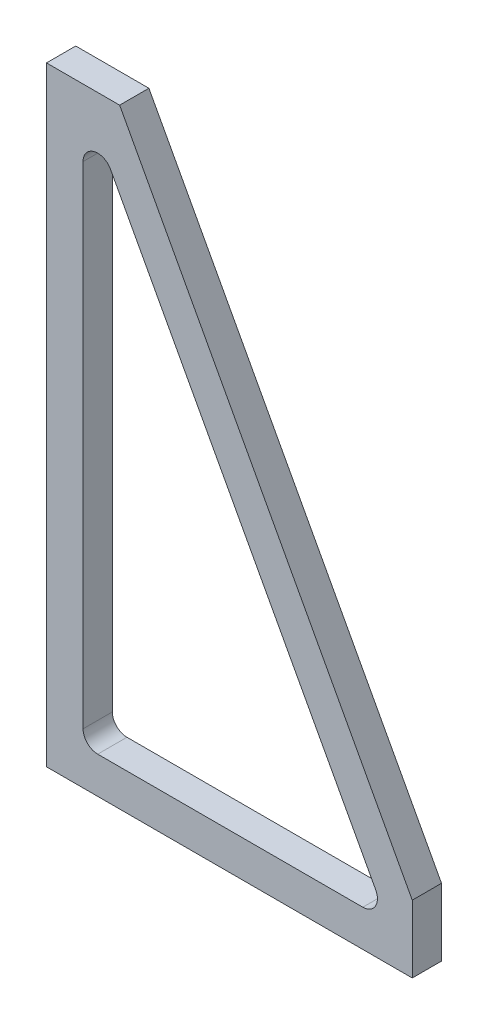
ISO-10303-21;
HEADER;
FILE_DESCRIPTION(('STEP AP214'),'2;1');
FILE_NAME('part.step','',(''),(''),'','','');
FILE_SCHEMA(('AUTOMOTIVE_DESIGN { 1 0 10303 214 1 1 1 1 }'));
ENDSEC;
DATA;
#1=APPLICATION_CONTEXT('core data for automotive mechanical design processes');
#2=APPLICATION_PROTOCOL_DEFINITION('international standard','automotive_design',2000,#1);
#3=PRODUCT_CONTEXT('',#1,'mechanical');
#4=PRODUCT('Part','Part','',(#3));
#5=PRODUCT_RELATED_PRODUCT_CATEGORY('part','',(#4));
#6=PRODUCT_DEFINITION_FORMATION('','',#4);
#7=PRODUCT_DEFINITION_CONTEXT('part definition',#1,'design');
#8=PRODUCT_DEFINITION('design','',#6,#7);
#9=PRODUCT_DEFINITION_SHAPE('','',#8);
#10=(LENGTH_UNIT() NAMED_UNIT(*) SI_UNIT(.MILLI.,.METRE.));
#11=(NAMED_UNIT(*) PLANE_ANGLE_UNIT() SI_UNIT($,.RADIAN.));
#12=(NAMED_UNIT(*) SI_UNIT($,.STERADIAN.) SOLID_ANGLE_UNIT());
#13=UNCERTAINTY_MEASURE_WITH_UNIT(LENGTH_MEASURE(1.E-05),#10,'distance_accuracy_value','');
#14=(GEOMETRIC_REPRESENTATION_CONTEXT(3) GLOBAL_UNCERTAINTY_ASSIGNED_CONTEXT((#13)) GLOBAL_UNIT_ASSIGNED_CONTEXT((#10,
#11,#12)) REPRESENTATION_CONTEXT('',''));
#15=CARTESIAN_POINT('',(0.,0.,0.));
#16=DIRECTION('',(0.,0.,1.));
#17=DIRECTION('',(1.,0.,0.));
#18=AXIS2_PLACEMENT_3D('',#15,#16,#17);
#19=CARTESIAN_POINT('',(0.,0.,12.));
#20=DIRECTION('',(0.,0.,1.));
#21=DIRECTION('',(1.,0.,0.));
#22=AXIS2_PLACEMENT_3D('',#19,#20,#21);
#23=PLANE('',#22);
#24=DIRECTION('',(1.,0.,0.));
#25=VECTOR('',#24,1.);
#26=CARTESIAN_POINT('',(0.,0.,12.));
#27=LINE('',#26,#25);
#28=CARTESIAN_POINT('',(0.,0.,12.));
#29=VERTEX_POINT('',#28);
#30=CARTESIAN_POINT('',(150.,0.,12.));
#31=VERTEX_POINT('',#30);
#32=EDGE_CURVE('E171',#29,#31,#27,.T.);
#33=ORIENTED_EDGE('',*,*,#32,.T.);
#34=DIRECTION('',(0.,1.,0.));
#35=VECTOR('',#34,1.);
#36=CARTESIAN_POINT('',(150.,0.,12.));
#37=LINE('',#36,#35);
#38=CARTESIAN_POINT('',(150.,27.6386984224302,12.));
#39=VERTEX_POINT('',#38);
#40=EDGE_CURVE('E176',#31,#39,#37,.T.);
#41=ORIENTED_EDGE('',*,*,#40,.T.);
#42=DIRECTION('',(-0.474918772063908,0.880029635831265,0.));
#43=VECTOR('',#42,1.);
#44=CARTESIAN_POINT('',(150.,27.6386984224302,12.));
#45=LINE('',#44,#43);
#46=CARTESIAN_POINT('',(30.,250.,12.));
#47=VERTEX_POINT('',#46);
#48=EDGE_CURVE('E177',#39,#47,#45,.T.);
#49=ORIENTED_EDGE('',*,*,#48,.T.);
#50=DIRECTION('',(-1.,0.,0.));
#51=VECTOR('',#50,1.);
#52=CARTESIAN_POINT('',(30.,250.,12.));
#53=LINE('',#52,#51);
#54=CARTESIAN_POINT('',(0.,250.,12.));
#55=VERTEX_POINT('',#54);
#56=EDGE_CURVE('E181',#47,#55,#53,.T.);
#57=ORIENTED_EDGE('',*,*,#56,.T.);
#58=DIRECTION('',(0.,-1.,0.));
#59=VECTOR('',#58,1.);
#60=CARTESIAN_POINT('',(0.,250.,12.));
#61=LINE('',#60,#59);
#62=EDGE_CURVE('E183',#55,#29,#61,.T.);
#63=ORIENTED_EDGE('',*,*,#62,.T.);
#64=EDGE_LOOP('',(#33,#41,#49,#57,#63));
#65=FACE_BOUND('',#64,.T.);
#66=DIRECTION('',(-0.474918772063908,0.880029635831265,0.));
#67=VECTOR('',#66,1.);
#68=CARTESIAN_POINT('',(135.,23.8495126323835,12.));
#69=LINE('',#68,#67);
#70=CARTESIAN_POINT('',(135.,23.8495126323835,12.));
#71=VERTEX_POINT('',#70);
#72=CARTESIAN_POINT('',(26.2801778149876,225.308522368561,12.));
#73=VERTEX_POINT('',#72);
#74=EDGE_CURVE('E127',#71,#73,#69,.T.);
#75=ORIENTED_EDGE('',*,*,#74,.F.);
#76=CARTESIAN_POINT('',(129.719822185012,21.,12.));
#77=DIRECTION('',(0.,0.,1.));
#78=DIRECTION('',(1.,0.,0.));
#79=AXIS2_PLACEMENT_3D('',#76,#77,#78);
#80=CIRCLE('',#79,6.00000000000001);
#81=CARTESIAN_POINT('',(129.719822185013,15.,12.));
#82=VERTEX_POINT('',#81);
#83=EDGE_CURVE('E122',#82,#71,#80,.T.);
#84=ORIENTED_EDGE('',*,*,#83,.F.);
#85=DIRECTION('',(1.,0.,0.));
#86=VECTOR('',#85,1.);
#87=CARTESIAN_POINT('',(21.,15.,12.));
#88=LINE('',#87,#86);
#89=CARTESIAN_POINT('',(21.,15.,12.));
#90=VERTEX_POINT('',#89);
#91=EDGE_CURVE('E152',#90,#82,#88,.T.);
#92=ORIENTED_EDGE('',*,*,#91,.F.);
#93=CARTESIAN_POINT('',(21.,21.,12.));
#94=DIRECTION('',(0.,0.,1.));
#95=DIRECTION('',(-1.,0.,0.));
#96=AXIS2_PLACEMENT_3D('',#93,#94,#95);
#97=CIRCLE('',#96,6.);
#98=CARTESIAN_POINT('',(15.,21.,12.));
#99=VERTEX_POINT('',#98);
#100=EDGE_CURVE('E146',#99,#90,#97,.T.);
#101=ORIENTED_EDGE('',*,*,#100,.F.);
#102=DIRECTION('',(0.,-1.,0.));
#103=VECTOR('',#102,1.);
#104=CARTESIAN_POINT('',(15.,222.459009736178,12.));
#105=LINE('',#104,#103);
#106=CARTESIAN_POINT('',(15.,222.459009736178,12.));
#107=VERTEX_POINT('',#106);
#108=EDGE_CURVE('E144',#107,#99,#105,.T.);
#109=ORIENTED_EDGE('',*,*,#108,.F.);
#110=CARTESIAN_POINT('',(21.,222.459009736178,12.));
#111=DIRECTION('',(0.,0.,1.));
#112=DIRECTION('',(1.,0.,0.));
#113=AXIS2_PLACEMENT_3D('',#110,#111,#112);
#114=CIRCLE('',#113,6.);
#115=EDGE_CURVE('E142',#73,#107,#114,.T.);
#116=ORIENTED_EDGE('',*,*,#115,.F.);
#117=EDGE_LOOP('',(#75,#84,#92,#101,#109,#116));
#118=FACE_BOUND('',#117,.T.);
#119=ADVANCED_FACE('F39',(#65,#118),#23,.T.);
#120=CARTESIAN_POINT('',(0.,0.,0.));
#121=DIRECTION('',(0.,0.,1.));
#122=DIRECTION('',(1.,0.,0.));
#123=AXIS2_PLACEMENT_3D('',#120,#121,#122);
#124=PLANE('',#123);
#125=DIRECTION('',(1.,0.,0.));
#126=VECTOR('',#125,1.);
#127=CARTESIAN_POINT('',(0.,0.,0.));
#128=LINE('',#127,#126);
#129=CARTESIAN_POINT('',(0.,0.,0.));
#130=VERTEX_POINT('',#129);
#131=CARTESIAN_POINT('',(150.,0.,0.));
#132=VERTEX_POINT('',#131);
#133=EDGE_CURVE('E138',#130,#132,#128,.T.);
#134=ORIENTED_EDGE('',*,*,#133,.F.);
#135=DIRECTION('',(0.,-1.,0.));
#136=VECTOR('',#135,1.);
#137=CARTESIAN_POINT('',(0.,250.,0.));
#138=LINE('',#137,#136);
#139=CARTESIAN_POINT('',(0.,250.,0.));
#140=VERTEX_POINT('',#139);
#141=EDGE_CURVE('E180',#140,#130,#138,.T.);
#142=ORIENTED_EDGE('',*,*,#141,.F.);
#143=DIRECTION('',(-1.,0.,0.));
#144=VECTOR('',#143,1.);
#145=CARTESIAN_POINT('',(30.,250.,0.));
#146=LINE('',#145,#144);
#147=CARTESIAN_POINT('',(30.,250.,0.));
#148=VERTEX_POINT('',#147);
#149=EDGE_CURVE('E195',#148,#140,#146,.T.);
#150=ORIENTED_EDGE('',*,*,#149,.F.);
#151=DIRECTION('',(-0.474918772063908,0.880029635831265,0.));
#152=VECTOR('',#151,1.);
#153=CARTESIAN_POINT('',(150.,27.6386984224302,0.));
#154=LINE('',#153,#152);
#155=CARTESIAN_POINT('',(150.,27.6386984224302,0.));
#156=VERTEX_POINT('',#155);
#157=EDGE_CURVE('E189',#156,#148,#154,.T.);
#158=ORIENTED_EDGE('',*,*,#157,.F.);
#159=DIRECTION('',(0.,1.,0.));
#160=VECTOR('',#159,1.);
#161=CARTESIAN_POINT('',(150.,0.,0.));
#162=LINE('',#161,#160);
#163=EDGE_CURVE('E187',#132,#156,#162,.T.);
#164=ORIENTED_EDGE('',*,*,#163,.F.);
#165=EDGE_LOOP('',(#134,#142,#150,#158,#164));
#166=FACE_BOUND('',#165,.T.);
#167=CARTESIAN_POINT('',(129.719822185012,21.,0.));
#168=DIRECTION('',(0.,0.,1.));
#169=DIRECTION('',(1.,0.,0.));
#170=AXIS2_PLACEMENT_3D('',#167,#168,#169);
#171=CIRCLE('',#170,6.00000000000001);
#172=CARTESIAN_POINT('',(129.719822185013,15.,0.));
#173=VERTEX_POINT('',#172);
#174=CARTESIAN_POINT('',(135.,23.8495126323835,0.));
#175=VERTEX_POINT('',#174);
#176=EDGE_CURVE('E65',#173,#175,#171,.T.);
#177=ORIENTED_EDGE('',*,*,#176,.T.);
#178=DIRECTION('',(-0.474918772063908,0.880029635831265,0.));
#179=VECTOR('',#178,1.);
#180=CARTESIAN_POINT('',(135.,23.8495126323835,0.));
#181=LINE('',#180,#179);
#182=CARTESIAN_POINT('',(26.2801778149876,225.308522368561,0.));
#183=VERTEX_POINT('',#182);
#184=EDGE_CURVE('E140',#175,#183,#181,.T.);
#185=ORIENTED_EDGE('',*,*,#184,.T.);
#186=CARTESIAN_POINT('',(21.,222.459009736178,0.));
#187=DIRECTION('',(0.,0.,1.));
#188=DIRECTION('',(1.,0.,0.));
#189=AXIS2_PLACEMENT_3D('',#186,#187,#188);
#190=CIRCLE('',#189,6.);
#191=CARTESIAN_POINT('',(15.,222.459009736178,0.));
#192=VERTEX_POINT('',#191);
#193=EDGE_CURVE('E151',#183,#192,#190,.T.);
#194=ORIENTED_EDGE('',*,*,#193,.T.);
#195=DIRECTION('',(0.,-1.,0.));
#196=VECTOR('',#195,1.);
#197=CARTESIAN_POINT('',(15.,222.459009736178,0.));
#198=LINE('',#197,#196);
#199=CARTESIAN_POINT('',(15.,21.,0.));
#200=VERTEX_POINT('',#199);
#201=EDGE_CURVE('E156',#192,#200,#198,.T.);
#202=ORIENTED_EDGE('',*,*,#201,.T.);
#203=CARTESIAN_POINT('',(21.,21.,0.));
#204=DIRECTION('',(0.,0.,1.));
#205=DIRECTION('',(-1.,0.,0.));
#206=AXIS2_PLACEMENT_3D('',#203,#204,#205);
#207=CIRCLE('',#206,6.);
#208=CARTESIAN_POINT('',(21.,15.,0.));
#209=VERTEX_POINT('',#208);
#210=EDGE_CURVE('E162',#200,#209,#207,.T.);
#211=ORIENTED_EDGE('',*,*,#210,.T.);
#212=DIRECTION('',(1.,0.,0.));
#213=VECTOR('',#212,1.);
#214=CARTESIAN_POINT('',(21.,15.,0.));
#215=LINE('',#214,#213);
#216=EDGE_CURVE('E131',#209,#173,#215,.T.);
#217=ORIENTED_EDGE('',*,*,#216,.T.);
#218=EDGE_LOOP('',(#177,#185,#194,#202,#211,#217));
#219=FACE_BOUND('',#218,.T.);
#220=ADVANCED_FACE('F211',(#166,#219),#124,.F.);
#221=CARTESIAN_POINT('',(0.,0.,12.));
#222=DIRECTION('',(0.,1.,0.));
#223=DIRECTION('',(0.,0.,1.));
#224=AXIS2_PLACEMENT_3D('',#221,#222,#223);
#225=PLANE('',#224);
#226=ORIENTED_EDGE('',*,*,#133,.T.);
#227=DIRECTION('',(0.,0.,-1.));
#228=VECTOR('',#227,1.);
#229=CARTESIAN_POINT('',(150.,0.,12.));
#230=LINE('',#229,#228);
#231=EDGE_CURVE('E11',#31,#132,#230,.T.);
#232=ORIENTED_EDGE('',*,*,#231,.F.);
#233=ORIENTED_EDGE('',*,*,#32,.F.);
#234=DIRECTION('',(0.,0.,-1.));
#235=VECTOR('',#234,1.);
#236=CARTESIAN_POINT('',(0.,0.,12.));
#237=LINE('',#236,#235);
#238=EDGE_CURVE('E184',#29,#130,#237,.T.);
#239=ORIENTED_EDGE('',*,*,#238,.T.);
#240=EDGE_LOOP('',(#226,#232,#233,#239));
#241=FACE_BOUND('',#240,.T.);
#242=ADVANCED_FACE('F41',(#241),#225,.F.);
#243=CARTESIAN_POINT('',(150.,0.,12.));
#244=DIRECTION('',(-1.,0.,0.));
#245=DIRECTION('',(0.,-1.,0.));
#246=AXIS2_PLACEMENT_3D('',#243,#244,#245);
#247=PLANE('',#246);
#248=ORIENTED_EDGE('',*,*,#163,.T.);
#249=DIRECTION('',(0.,0.,-1.));
#250=VECTOR('',#249,1.);
#251=CARTESIAN_POINT('',(150.,27.6386984224302,12.));
#252=LINE('',#251,#250);
#253=EDGE_CURVE('E50',#39,#156,#252,.T.);
#254=ORIENTED_EDGE('',*,*,#253,.F.);
#255=ORIENTED_EDGE('',*,*,#40,.F.);
#256=ORIENTED_EDGE('',*,*,#231,.T.);
#257=EDGE_LOOP('',(#248,#254,#255,#256));
#258=FACE_BOUND('',#257,.T.);
#259=ADVANCED_FACE('F230',(#258),#247,.F.);
#260=CARTESIAN_POINT('',(150.,27.6386984224302,12.));
#261=DIRECTION('',(-0.880029635831265,-0.474918772063908,0.));
#262=DIRECTION('',(0.474918772063908,-0.880029635831265,0.));
#263=AXIS2_PLACEMENT_3D('',#260,#261,#262);
#264=PLANE('',#263);
#265=ORIENTED_EDGE('',*,*,#157,.T.);
#266=DIRECTION('',(0.,0.,-1.));
#267=VECTOR('',#266,1.);
#268=CARTESIAN_POINT('',(30.,250.,12.));
#269=LINE('',#268,#267);
#270=EDGE_CURVE('E196',#47,#148,#269,.T.);
#271=ORIENTED_EDGE('',*,*,#270,.F.);
#272=ORIENTED_EDGE('',*,*,#48,.F.);
#273=ORIENTED_EDGE('',*,*,#253,.T.);
#274=EDGE_LOOP('',(#265,#271,#272,#273));
#275=FACE_BOUND('',#274,.T.);
#276=ADVANCED_FACE('F210',(#275),#264,.F.);
#277=CARTESIAN_POINT('',(30.,250.,12.));
#278=DIRECTION('',(0.,-1.,0.));
#279=DIRECTION('',(1.,0.,0.));
#280=AXIS2_PLACEMENT_3D('',#277,#278,#279);
#281=PLANE('',#280);
#282=ORIENTED_EDGE('',*,*,#149,.T.);
#283=DIRECTION('',(0.,0.,-1.));
#284=VECTOR('',#283,1.);
#285=CARTESIAN_POINT('',(0.,250.,12.));
#286=LINE('',#285,#284);
#287=EDGE_CURVE('E200',#55,#140,#286,.T.);
#288=ORIENTED_EDGE('',*,*,#287,.F.);
#289=ORIENTED_EDGE('',*,*,#56,.F.);
#290=ORIENTED_EDGE('',*,*,#270,.T.);
#291=EDGE_LOOP('',(#282,#288,#289,#290));
#292=FACE_BOUND('',#291,.T.);
#293=ADVANCED_FACE('F216',(#292),#281,.F.);
#294=CARTESIAN_POINT('',(0.,250.,12.));
#295=DIRECTION('',(1.,0.,0.));
#296=DIRECTION('',(0.,1.,0.));
#297=AXIS2_PLACEMENT_3D('',#294,#295,#296);
#298=PLANE('',#297);
#299=ORIENTED_EDGE('',*,*,#141,.T.);
#300=ORIENTED_EDGE('',*,*,#238,.F.);
#301=ORIENTED_EDGE('',*,*,#62,.F.);
#302=ORIENTED_EDGE('',*,*,#287,.T.);
#303=EDGE_LOOP('',(#299,#300,#301,#302));
#304=FACE_BOUND('',#303,.T.);
#305=ADVANCED_FACE('F225',(#304),#298,.F.);
#306=CARTESIAN_POINT('',(129.719822185012,21.,12.));
#307=DIRECTION('',(0.,0.,-1.));
#308=DIRECTION('',(-1.,0.,0.));
#309=AXIS2_PLACEMENT_3D('',#306,#307,#308);
#310=CYLINDRICAL_SURFACE('',#309,6.00000000000001);
#311=ORIENTED_EDGE('',*,*,#176,.F.);
#312=DIRECTION('',(0.,0.,-1.));
#313=VECTOR('',#312,1.);
#314=CARTESIAN_POINT('',(129.719822185013,15.,12.));
#315=LINE('',#314,#313);
#316=EDGE_CURVE('E128',#82,#173,#315,.T.);
#317=ORIENTED_EDGE('',*,*,#316,.F.);
#318=ORIENTED_EDGE('',*,*,#83,.T.);
#319=DIRECTION('',(0.,0.,-1.));
#320=VECTOR('',#319,1.);
#321=CARTESIAN_POINT('',(135.,23.8495126323835,12.));
#322=LINE('',#321,#320);
#323=EDGE_CURVE('E124',#71,#175,#322,.T.);
#324=ORIENTED_EDGE('',*,*,#323,.T.);
#325=EDGE_LOOP('',(#311,#317,#318,#324));
#326=FACE_BOUND('',#325,.T.);
#327=ADVANCED_FACE('F125',(#326),#310,.F.);
#328=CARTESIAN_POINT('',(135.,23.8495126323835,12.));
#329=DIRECTION('',(-0.880029635831265,-0.474918772063908,0.));
#330=DIRECTION('',(0.474918772063908,-0.880029635831265,0.));
#331=AXIS2_PLACEMENT_3D('',#328,#329,#330);
#332=PLANE('',#331);
#333=ORIENTED_EDGE('',*,*,#184,.F.);
#334=ORIENTED_EDGE('',*,*,#323,.F.);
#335=ORIENTED_EDGE('',*,*,#74,.T.);
#336=DIRECTION('',(0.,0.,-1.));
#337=VECTOR('',#336,1.);
#338=CARTESIAN_POINT('',(26.2801778149876,225.308522368561,12.));
#339=LINE('',#338,#337);
#340=EDGE_CURVE('E137',#73,#183,#339,.T.);
#341=ORIENTED_EDGE('',*,*,#340,.T.);
#342=EDGE_LOOP('',(#333,#334,#335,#341));
#343=FACE_BOUND('',#342,.T.);
#344=ADVANCED_FACE('F132',(#343),#332,.T.);
#345=CARTESIAN_POINT('',(21.,222.459009736178,12.));
#346=DIRECTION('',(0.,0.,-1.));
#347=DIRECTION('',(-1.,0.,0.));
#348=AXIS2_PLACEMENT_3D('',#345,#346,#347);
#349=CYLINDRICAL_SURFACE('',#348,6.);
#350=ORIENTED_EDGE('',*,*,#193,.F.);
#351=ORIENTED_EDGE('',*,*,#340,.F.);
#352=ORIENTED_EDGE('',*,*,#115,.T.);
#353=DIRECTION('',(0.,0.,-1.));
#354=VECTOR('',#353,1.);
#355=CARTESIAN_POINT('',(15.,222.459009736178,12.));
#356=LINE('',#355,#354);
#357=EDGE_CURVE('E169',#107,#192,#356,.T.);
#358=ORIENTED_EDGE('',*,*,#357,.T.);
#359=EDGE_LOOP('',(#350,#351,#352,#358));
#360=FACE_BOUND('',#359,.T.);
#361=ADVANCED_FACE('F272',(#360),#349,.F.);
#362=CARTESIAN_POINT('',(15.,222.459009736178,12.));
#363=DIRECTION('',(1.,0.,0.));
#364=DIRECTION('',(0.,0.,-1.));
#365=AXIS2_PLACEMENT_3D('',#362,#363,#364);
#366=PLANE('',#365);
#367=ORIENTED_EDGE('',*,*,#201,.F.);
#368=ORIENTED_EDGE('',*,*,#357,.F.);
#369=ORIENTED_EDGE('',*,*,#108,.T.);
#370=DIRECTION('',(0.,0.,-1.));
#371=VECTOR('',#370,1.);
#372=CARTESIAN_POINT('',(15.,21.,12.));
#373=LINE('',#372,#371);
#374=EDGE_CURVE('E166',#99,#200,#373,.T.);
#375=ORIENTED_EDGE('',*,*,#374,.T.);
#376=EDGE_LOOP('',(#367,#368,#369,#375));
#377=FACE_BOUND('',#376,.T.);
#378=ADVANCED_FACE('F282',(#377),#366,.T.);
#379=CARTESIAN_POINT('',(21.,21.,12.));
#380=DIRECTION('',(0.,0.,-1.));
#381=DIRECTION('',(-1.,0.,0.));
#382=AXIS2_PLACEMENT_3D('',#379,#380,#381);
#383=CYLINDRICAL_SURFACE('',#382,6.);
#384=ORIENTED_EDGE('',*,*,#210,.F.);
#385=ORIENTED_EDGE('',*,*,#374,.F.);
#386=ORIENTED_EDGE('',*,*,#100,.T.);
#387=DIRECTION('',(0.,0.,-1.));
#388=VECTOR('',#387,1.);
#389=CARTESIAN_POINT('',(21.,15.,12.));
#390=LINE('',#389,#388);
#391=EDGE_CURVE('E53',#90,#209,#390,.T.);
#392=ORIENTED_EDGE('',*,*,#391,.T.);
#393=EDGE_LOOP('',(#384,#385,#386,#392));
#394=FACE_BOUND('',#393,.T.);
#395=ADVANCED_FACE('F286',(#394),#383,.F.);
#396=CARTESIAN_POINT('',(21.,15.,12.));
#397=DIRECTION('',(0.,1.,0.));
#398=DIRECTION('',(-1.,0.,0.));
#399=AXIS2_PLACEMENT_3D('',#396,#397,#398);
#400=PLANE('',#399);
#401=ORIENTED_EDGE('',*,*,#216,.F.);
#402=ORIENTED_EDGE('',*,*,#391,.F.);
#403=ORIENTED_EDGE('',*,*,#91,.T.);
#404=ORIENTED_EDGE('',*,*,#316,.T.);
#405=EDGE_LOOP('',(#401,#402,#403,#404));
#406=FACE_BOUND('',#405,.T.);
#407=ADVANCED_FACE('F299',(#406),#400,.T.);
#408=CLOSED_SHELL('',(#119,#220,#242,#259,#276,#293,#305,#327,#344,#361,#378,#395,#407));
#409=MANIFOLD_SOLID_BREP('B2',#408);
#410=ADVANCED_BREP_SHAPE_REPRESENTATION('',(#18,#409),#14);
#411=SHAPE_DEFINITION_REPRESENTATION(#9,#410);
ENDSEC;
END-ISO-10303-21;
